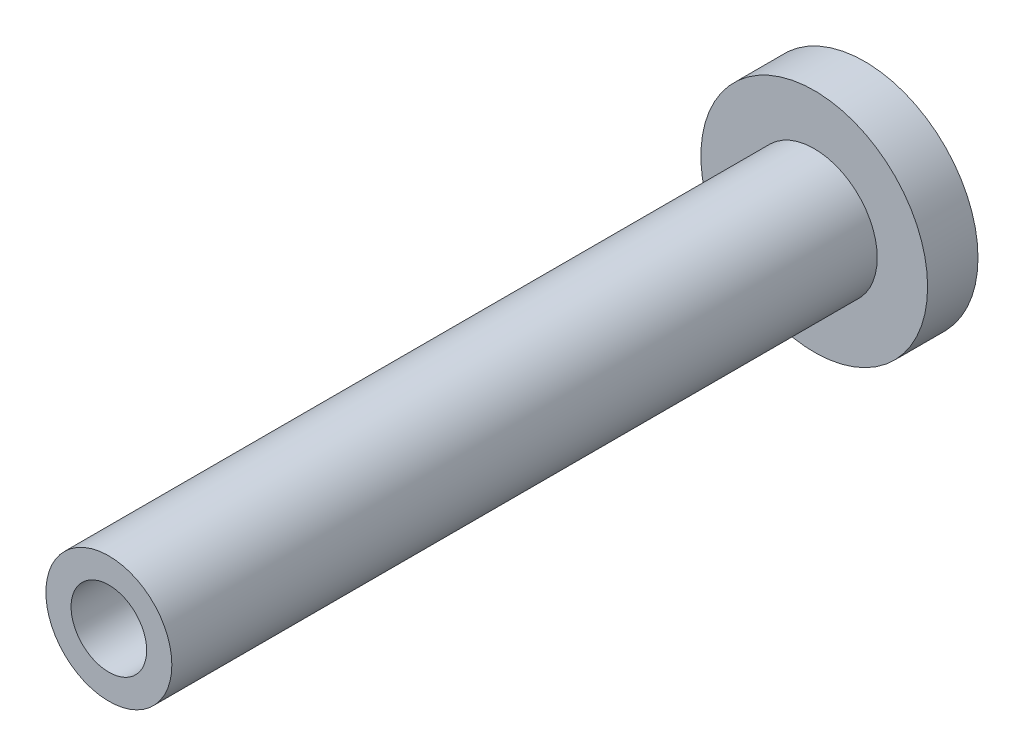
ISO-10303-21;
HEADER;
FILE_DESCRIPTION(('STEP AP214'),'2;1');
FILE_NAME('part.step','',(''),(''),'','','');
FILE_SCHEMA(('AUTOMOTIVE_DESIGN { 1 0 10303 214 1 1 1 1 }'));
ENDSEC;
DATA;
#1=APPLICATION_CONTEXT('core data for automotive mechanical design processes');
#2=APPLICATION_PROTOCOL_DEFINITION('international standard','automotive_design',2000,#1);
#3=PRODUCT_CONTEXT('',#1,'mechanical');
#4=PRODUCT('Part','Part','',(#3));
#5=PRODUCT_RELATED_PRODUCT_CATEGORY('part','',(#4));
#6=PRODUCT_DEFINITION_FORMATION('','',#4);
#7=PRODUCT_DEFINITION_CONTEXT('part definition',#1,'design');
#8=PRODUCT_DEFINITION('design','',#6,#7);
#9=PRODUCT_DEFINITION_SHAPE('','',#8);
#10=(LENGTH_UNIT() NAMED_UNIT(*) SI_UNIT(.MILLI.,.METRE.));
#11=(NAMED_UNIT(*) PLANE_ANGLE_UNIT() SI_UNIT($,.RADIAN.));
#12=(NAMED_UNIT(*) SI_UNIT($,.STERADIAN.) SOLID_ANGLE_UNIT());
#13=UNCERTAINTY_MEASURE_WITH_UNIT(LENGTH_MEASURE(1.E-05),#10,'distance_accuracy_value','');
#14=(GEOMETRIC_REPRESENTATION_CONTEXT(3) GLOBAL_UNCERTAINTY_ASSIGNED_CONTEXT((#13)) GLOBAL_UNIT_ASSIGNED_CONTEXT((#10,
#11,#12)) REPRESENTATION_CONTEXT('',''));
#15=CARTESIAN_POINT('',(0.,0.,0.));
#16=DIRECTION('',(0.,0.,1.));
#17=DIRECTION('',(1.,0.,0.));
#18=AXIS2_PLACEMENT_3D('',#15,#16,#17);
#19=CARTESIAN_POINT('',(0.,0.,2.));
#20=DIRECTION('',(0.,0.,1.));
#21=DIRECTION('',(1.,0.,0.));
#22=AXIS2_PLACEMENT_3D('',#19,#20,#21);
#23=PLANE('',#22);
#24=CARTESIAN_POINT('',(0.,0.,2.));
#25=DIRECTION('',(0.,0.,1.));
#26=DIRECTION('',(1.,0.,0.));
#27=AXIS2_PLACEMENT_3D('',#24,#25,#26);
#28=CIRCLE('',#27,2.5);
#29=CARTESIAN_POINT('',(2.5,0.,2.));
#30=VERTEX_POINT('',#29);
#31=EDGE_CURVE('E37',#30,#30,#28,.T.);
#32=ORIENTED_EDGE('',*,*,#31,.F.);
#33=EDGE_LOOP('',(#32));
#34=FACE_BOUND('',#33,.T.);
#35=CARTESIAN_POINT('',(0.,0.,2.));
#36=DIRECTION('',(0.,0.,1.));
#37=DIRECTION('',(1.,0.,0.));
#38=AXIS2_PLACEMENT_3D('',#35,#36,#37);
#39=CIRCLE('',#38,4.5);
#40=CARTESIAN_POINT('',(4.5,0.,2.));
#41=VERTEX_POINT('',#40);
#42=EDGE_CURVE('E46',#41,#41,#39,.T.);
#43=ORIENTED_EDGE('',*,*,#42,.T.);
#44=EDGE_LOOP('',(#43));
#45=FACE_BOUND('',#44,.T.);
#46=ADVANCED_FACE('F30',(#34,#45),#23,.T.);
#47=CARTESIAN_POINT('',(0.,0.,0.));
#48=DIRECTION('',(0.,0.,1.));
#49=DIRECTION('',(1.,0.,0.));
#50=AXIS2_PLACEMENT_3D('',#47,#48,#49);
#51=PLANE('',#50);
#52=CARTESIAN_POINT('',(0.,0.,0.));
#53=DIRECTION('',(0.,0.,1.));
#54=DIRECTION('',(1.,0.,0.));
#55=AXIS2_PLACEMENT_3D('',#52,#53,#54);
#56=CIRCLE('',#55,4.23205080756888);
#57=CARTESIAN_POINT('',(4.23205080756888,0.,0.));
#58=VERTEX_POINT('',#57);
#59=EDGE_CURVE('E10',#58,#58,#56,.T.);
#60=ORIENTED_EDGE('',*,*,#59,.T.);
#61=EDGE_LOOP('',(#60));
#62=FACE_BOUND('',#61,.T.);
#63=CARTESIAN_POINT('',(0.,0.,0.));
#64=DIRECTION('',(0.,0.,1.));
#65=DIRECTION('',(1.,0.,0.));
#66=AXIS2_PLACEMENT_3D('',#63,#64,#65);
#67=CIRCLE('',#66,4.5);
#68=CARTESIAN_POINT('',(4.5,0.,0.));
#69=VERTEX_POINT('',#68);
#70=EDGE_CURVE('E53',#69,#69,#67,.T.);
#71=ORIENTED_EDGE('',*,*,#70,.F.);
#72=EDGE_LOOP('',(#71));
#73=FACE_BOUND('',#72,.T.);
#74=ADVANCED_FACE('F86',(#62,#73),#51,.F.);
#75=CARTESIAN_POINT('',(0.,0.,2.));
#76=DIRECTION('',(0.,0.,-1.));
#77=DIRECTION('',(-1.,0.,0.));
#78=AXIS2_PLACEMENT_3D('',#75,#76,#77);
#79=CYLINDRICAL_SURFACE('',#78,4.5);
#80=ORIENTED_EDGE('',*,*,#42,.F.);
#81=EDGE_LOOP('',(#80));
#82=FACE_BOUND('',#81,.T.);
#83=ORIENTED_EDGE('',*,*,#70,.T.);
#84=EDGE_LOOP('',(#83));
#85=FACE_BOUND('',#84,.T.);
#86=ADVANCED_FACE('F92',(#82,#85),#79,.T.);
#87=CARTESIAN_POINT('',(0.,0.,1.));
#88=DIRECTION('',(0.,0.,-1.));
#89=DIRECTION('',(-1.,0.,0.));
#90=AXIS2_PLACEMENT_3D('',#87,#88,#89);
#91=PLANE('',#90);
#92=CARTESIAN_POINT('',(0.,0.,1.));
#93=DIRECTION('',(0.,0.,-1.));
#94=DIRECTION('',(-1.,0.,0.));
#95=AXIS2_PLACEMENT_3D('',#92,#93,#94);
#96=CIRCLE('',#95,2.5);
#97=CARTESIAN_POINT('',(-2.5,0.,1.));
#98=VERTEX_POINT('',#97);
#99=EDGE_CURVE('E41',#98,#98,#96,.T.);
#100=ORIENTED_EDGE('',*,*,#99,.T.);
#101=EDGE_LOOP('',(#100));
#102=FACE_BOUND('',#101,.T.);
#103=ADVANCED_FACE('F82',(#102),#91,.T.);
#104=CARTESIAN_POINT('',(0.,0.,30.));
#105=DIRECTION('',(0.,0.,-1.));
#106=DIRECTION('',(-1.,0.,0.));
#107=AXIS2_PLACEMENT_3D('',#104,#105,#106);
#108=CYLINDRICAL_SURFACE('',#107,2.5);
#109=CARTESIAN_POINT('',(0.,0.,30.));
#110=DIRECTION('',(0.,0.,1.));
#111=DIRECTION('',(1.,0.,0.));
#112=AXIS2_PLACEMENT_3D('',#109,#110,#111);
#113=CIRCLE('',#112,2.5);
#114=CARTESIAN_POINT('',(2.5,0.,30.));
#115=VERTEX_POINT('',#114);
#116=EDGE_CURVE('E49',#115,#115,#113,.T.);
#117=ORIENTED_EDGE('',*,*,#116,.F.);
#118=EDGE_LOOP('',(#117));
#119=FACE_BOUND('',#118,.T.);
#120=ORIENTED_EDGE('',*,*,#31,.T.);
#121=EDGE_LOOP('',(#120));
#122=FACE_BOUND('',#121,.T.);
#123=ADVANCED_FACE('F73',(#119,#122),#108,.T.);
#124=CARTESIAN_POINT('',(0.,0.,30.));
#125=DIRECTION('',(0.,0.,1.));
#126=DIRECTION('',(1.,0.,0.));
#127=AXIS2_PLACEMENT_3D('',#124,#125,#126);
#128=PLANE('',#127);
#129=CARTESIAN_POINT('',(0.,0.,30.));
#130=DIRECTION('',(0.,0.,1.));
#131=DIRECTION('',(1.,0.,0.));
#132=AXIS2_PLACEMENT_3D('',#129,#130,#131);
#133=CIRCLE('',#132,1.5);
#134=CARTESIAN_POINT('',(1.5,0.,30.));
#135=VERTEX_POINT('',#134);
#136=EDGE_CURVE('E62',#135,#135,#133,.T.);
#137=ORIENTED_EDGE('',*,*,#136,.F.);
#138=EDGE_LOOP('',(#137));
#139=FACE_BOUND('',#138,.T.);
#140=ORIENTED_EDGE('',*,*,#116,.T.);
#141=EDGE_LOOP('',(#140));
#142=FACE_BOUND('',#141,.T.);
#143=ADVANCED_FACE('F71',(#139,#142),#128,.T.);
#144=CARTESIAN_POINT('',(0.,0.,20.));
#145=DIRECTION('',(0.,0.,1.));
#146=DIRECTION('',(1.,0.,0.));
#147=AXIS2_PLACEMENT_3D('',#144,#145,#146);
#148=CYLINDRICAL_SURFACE('',#147,1.5);
#149=CARTESIAN_POINT('',(0.,0.,20.));
#150=DIRECTION('',(0.,0.,1.));
#151=DIRECTION('',(1.,0.,0.));
#152=AXIS2_PLACEMENT_3D('',#149,#150,#151);
#153=CIRCLE('',#152,1.5);
#154=CARTESIAN_POINT('',(1.5,0.,20.));
#155=VERTEX_POINT('',#154);
#156=EDGE_CURVE('E58',#155,#155,#153,.T.);
#157=ORIENTED_EDGE('',*,*,#156,.F.);
#158=EDGE_LOOP('',(#157));
#159=FACE_BOUND('',#158,.T.);
#160=ORIENTED_EDGE('',*,*,#136,.T.);
#161=EDGE_LOOP('',(#160));
#162=FACE_BOUND('',#161,.T.);
#163=ADVANCED_FACE('F69',(#159,#162),#148,.F.);
#164=CARTESIAN_POINT('',(0.,0.,20.));
#165=DIRECTION('',(0.,0.,1.));
#166=DIRECTION('',(1.,0.,0.));
#167=AXIS2_PLACEMENT_3D('',#164,#165,#166);
#168=PLANE('',#167);
#169=ORIENTED_EDGE('',*,*,#156,.T.);
#170=EDGE_LOOP('',(#169));
#171=FACE_BOUND('',#170,.T.);
#172=ADVANCED_FACE('F79',(#171),#168,.T.);
#173=CARTESIAN_POINT('',(0.,0.,2.));
#174=DIRECTION('',(0.,0.,1.));
#175=DIRECTION('',(1.,0.,0.));
#176=AXIS2_PLACEMENT_3D('',#173,#174,#175);
#177=TOROIDAL_SURFACE('',#176,4.23205080756888,2.);
#178=ORIENTED_EDGE('',*,*,#99,.F.);
#179=EDGE_LOOP('',(#178));
#180=FACE_BOUND('',#179,.T.);
#181=ORIENTED_EDGE('',*,*,#59,.F.);
#182=EDGE_LOOP('',(#181));
#183=FACE_BOUND('',#182,.T.);
#184=ADVANCED_FACE('F32',(#180,#183),#177,.T.);
#185=CLOSED_SHELL('',(#46,#74,#86,#103,#123,#143,#163,#172,#184));
#186=MANIFOLD_SOLID_BREP('B2',#185);
#187=ADVANCED_BREP_SHAPE_REPRESENTATION('',(#18,#186),#14);
#188=SHAPE_DEFINITION_REPRESENTATION(#9,#187);
ENDSEC;
END-ISO-10303-21;
